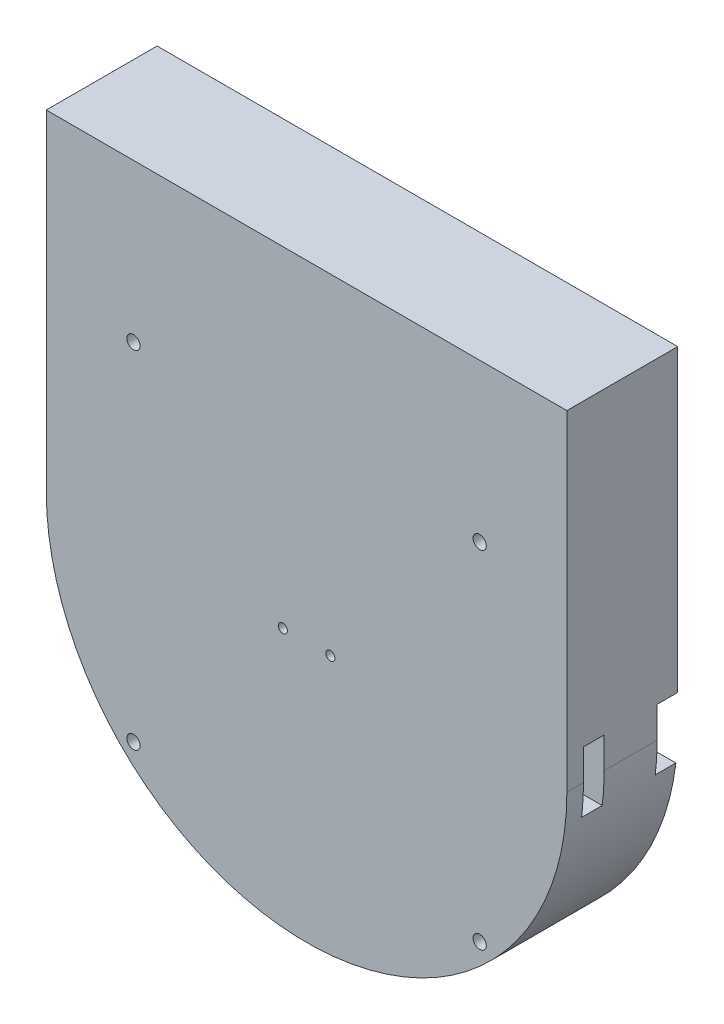
ISO-10303-21;
HEADER;
FILE_DESCRIPTION(('STEP AP214'),'2;1');
FILE_NAME('part.step','',(''),(''),'','','');
FILE_SCHEMA(('AUTOMOTIVE_DESIGN { 1 0 10303 214 1 1 1 1 }'));
ENDSEC;
DATA;
#1=APPLICATION_CONTEXT('core data for automotive mechanical design processes');
#2=APPLICATION_PROTOCOL_DEFINITION('international standard','automotive_design',2000,#1);
#3=PRODUCT_CONTEXT('',#1,'mechanical');
#4=PRODUCT('Part','Part','',(#3));
#5=PRODUCT_RELATED_PRODUCT_CATEGORY('part','',(#4));
#6=PRODUCT_DEFINITION_FORMATION('','',#4);
#7=PRODUCT_DEFINITION_CONTEXT('part definition',#1,'design');
#8=PRODUCT_DEFINITION('design','',#6,#7);
#9=PRODUCT_DEFINITION_SHAPE('','',#8);
#10=(LENGTH_UNIT() NAMED_UNIT(*) SI_UNIT(.MILLI.,.METRE.));
#11=(NAMED_UNIT(*) PLANE_ANGLE_UNIT() SI_UNIT($,.RADIAN.));
#12=(NAMED_UNIT(*) SI_UNIT($,.STERADIAN.) SOLID_ANGLE_UNIT());
#13=UNCERTAINTY_MEASURE_WITH_UNIT(LENGTH_MEASURE(1.E-05),#10,'distance_accuracy_value','');
#14=(GEOMETRIC_REPRESENTATION_CONTEXT(3) GLOBAL_UNCERTAINTY_ASSIGNED_CONTEXT((#13)) GLOBAL_UNIT_ASSIGNED_CONTEXT((#10,
#11,#12)) REPRESENTATION_CONTEXT('',''));
#15=CARTESIAN_POINT('',(0.,0.,0.));
#16=DIRECTION('',(0.,0.,1.));
#17=DIRECTION('',(1.,0.,0.));
#18=AXIS2_PLACEMENT_3D('',#15,#16,#17);
#19=CARTESIAN_POINT('',(0.,-1.18665937942703E-13,-22.8250000000006));
#20=DIRECTION('',(0.,0.,1.));
#21=DIRECTION('',(-0.707106781186544,0.70710678118655,0.));
#22=AXIS2_PLACEMENT_3D('',#19,#20,#21);
#23=PLANE('',#22);
#24=CARTESIAN_POINT('',(-41.8960767853027,41.896076785303,-22.8250000000007));
#25=DIRECTION('',(0.,0.,-1.));
#26=DIRECTION('',(0.,1.,0.));
#27=AXIS2_PLACEMENT_3D('',#24,#25,#26);
#28=CIRCLE('',#27,1.6000000000001);
#29=CARTESIAN_POINT('',(-41.8960767853027,43.4960767853031,-22.8250000000007));
#30=VERTEX_POINT('',#29);
#31=EDGE_CURVE('E293',#30,#30,#28,.F.);
#32=ORIENTED_EDGE('',*,*,#31,.T.);
#33=EDGE_LOOP('',(#32));
#34=FACE_BOUND('',#33,.T.);
#35=CARTESIAN_POINT('',(-41.8960767853031,-41.8960767853029,-22.8250000000006));
#36=DIRECTION('',(0.,0.,-1.));
#37=DIRECTION('',(0.,1.,0.));
#38=AXIS2_PLACEMENT_3D('',#35,#36,#37);
#39=CIRCLE('',#38,1.60000000000007);
#40=CARTESIAN_POINT('',(-41.8960767853031,-40.2960767853028,-22.8250000000006));
#41=VERTEX_POINT('',#40);
#42=EDGE_CURVE('E301',#41,#41,#39,.F.);
#43=ORIENTED_EDGE('',*,*,#42,.T.);
#44=EDGE_LOOP('',(#43));
#45=FACE_BOUND('',#44,.T.);
#46=CARTESIAN_POINT('',(41.8960767853028,-41.8960767853032,-22.8250000000005));
#47=DIRECTION('',(0.,0.,-1.));
#48=DIRECTION('',(0.,1.,0.));
#49=AXIS2_PLACEMENT_3D('',#46,#47,#48);
#50=CIRCLE('',#49,1.60000000000006);
#51=CARTESIAN_POINT('',(41.8960767853028,-40.2960767853032,-22.8250000000005));
#52=VERTEX_POINT('',#51);
#53=EDGE_CURVE('E292',#52,#52,#50,.F.);
#54=ORIENTED_EDGE('',*,*,#53,.T.);
#55=EDGE_LOOP('',(#54));
#56=FACE_BOUND('',#55,.T.);
#57=CARTESIAN_POINT('',(41.8960767853031,41.8960767853026,-22.8250000000007));
#58=DIRECTION('',(0.,0.,-1.));
#59=DIRECTION('',(0.,1.,0.));
#60=AXIS2_PLACEMENT_3D('',#57,#58,#59);
#61=CIRCLE('',#60,1.60000000000009);
#62=CARTESIAN_POINT('',(41.8960767853031,43.4960767853027,-22.8250000000007));
#63=VERTEX_POINT('',#62);
#64=EDGE_CURVE('E282',#63,#63,#61,.F.);
#65=ORIENTED_EDGE('',*,*,#64,.T.);
#66=EDGE_LOOP('',(#65));
#67=FACE_BOUND('',#66,.T.);
#68=CARTESIAN_POINT('',(0.,0.,-22.8250000000006));
#69=DIRECTION('',(0.,0.,-1.));
#70=DIRECTION('',(0.,1.,0.));
#71=AXIS2_PLACEMENT_3D('',#68,#69,#70);
#72=CIRCLE('',#71,55.);
#73=CARTESIAN_POINT('',(54.4862367942584,-7.5,-22.8250000000006));
#74=VERTEX_POINT('',#73);
#75=CARTESIAN_POINT('',(54.4862367942584,7.49999999999999,-22.8250000000008));
#76=VERTEX_POINT('',#75);
#77=EDGE_CURVE('E11',#74,#76,#72,.T.);
#78=ORIENTED_EDGE('',*,*,#77,.F.);
#79=DIRECTION('',(1.,0.,0.));
#80=VECTOR('',#79,1.);
#81=CARTESIAN_POINT('',(-63.001,-7.5,-22.8250000000008));
#82=LINE('',#81,#80);
#83=CARTESIAN_POINT('',(62.5519783859791,-7.5,-22.8250000000008));
#84=VERTEX_POINT('',#83);
#85=EDGE_CURVE('E195',#74,#84,#82,.T.);
#86=ORIENTED_EDGE('',*,*,#85,.T.);
#87=CARTESIAN_POINT('',(0.,0.,-22.8250000000006));
#88=DIRECTION('',(0.,0.,-1.));
#89=DIRECTION('',(0.,1.,0.));
#90=AXIS2_PLACEMENT_3D('',#87,#88,#89);
#91=CIRCLE('',#90,63.);
#92=CARTESIAN_POINT('',(-63.,0.,-22.8250000000007));
#93=VERTEX_POINT('',#92);
#94=EDGE_CURVE('E231',#84,#93,#91,.T.);
#95=ORIENTED_EDGE('',*,*,#94,.T.);
#96=DIRECTION('',(0.,1.,0.));
#97=VECTOR('',#96,1.);
#98=CARTESIAN_POINT('',(-63.,80.0000000000004,-22.8250000000008));
#99=LINE('',#98,#97);
#100=CARTESIAN_POINT('',(-63.,80.,-22.8250000000008));
#101=VERTEX_POINT('',#100);
#102=EDGE_CURVE('E226',#93,#101,#99,.T.);
#103=ORIENTED_EDGE('',*,*,#102,.T.);
#104=DIRECTION('',(1.,0.,0.));
#105=VECTOR('',#104,1.);
#106=CARTESIAN_POINT('',(-63.0000000000001,80.,-22.8250000000008));
#107=LINE('',#106,#105);
#108=CARTESIAN_POINT('',(63.,80.,-22.8250000000008));
#109=VERTEX_POINT('',#108);
#110=EDGE_CURVE('E235',#101,#109,#107,.T.);
#111=ORIENTED_EDGE('',*,*,#110,.T.);
#112=DIRECTION('',(0.,-1.,0.));
#113=VECTOR('',#112,1.);
#114=CARTESIAN_POINT('',(63.,80.0000000000004,-22.8250000000008));
#115=LINE('',#114,#113);
#116=CARTESIAN_POINT('',(63.,7.49999999999999,-22.8250000000008));
#117=VERTEX_POINT('',#116);
#118=EDGE_CURVE('E230',#109,#117,#115,.T.);
#119=ORIENTED_EDGE('',*,*,#118,.T.);
#120=DIRECTION('',(1.,0.,0.));
#121=VECTOR('',#120,1.);
#122=CARTESIAN_POINT('',(-63.001,7.49999999999999,-22.8250000000008));
#123=LINE('',#122,#121);
#124=EDGE_CURVE('E198',#76,#117,#123,.T.);
#125=ORIENTED_EDGE('',*,*,#124,.F.);
#126=EDGE_LOOP('',(#78,#86,#95,#103,#111,#119,#125));
#127=FACE_BOUND('',#126,.T.);
#128=CARTESIAN_POINT('',(-59.25,1.2490009027033E-13,-22.8250000000007));
#129=DIRECTION('',(0.,0.,-1.));
#130=DIRECTION('',(0.,1.,0.));
#131=AXIS2_PLACEMENT_3D('',#128,#129,#130);
#132=CIRCLE('',#131,1.60000000000008);
#133=CARTESIAN_POINT('',(-57.6499999999999,1.2490009027033E-13,-22.8250000000006));
#134=VERTEX_POINT('',#133);
#135=EDGE_CURVE('E317',#134,#134,#132,.T.);
#136=ORIENTED_EDGE('',*,*,#135,.F.);
#137=EDGE_LOOP('',(#136));
#138=FACE_BOUND('',#137,.T.);
#139=CARTESIAN_POINT('',(0.,59.2499999999999,-22.8250000000008));
#140=DIRECTION('',(0.,0.,-1.));
#141=DIRECTION('',(0.,1.,0.));
#142=AXIS2_PLACEMENT_3D('',#139,#140,#141);
#143=CIRCLE('',#142,1.60000000000012);
#144=CARTESIAN_POINT('',(1.60000000000008,59.2499999999999,-22.8250000000008));
#145=VERTEX_POINT('',#144);
#146=EDGE_CURVE('E311',#145,#145,#143,.T.);
#147=ORIENTED_EDGE('',*,*,#146,.F.);
#148=EDGE_LOOP('',(#147));
#149=FACE_BOUND('',#148,.T.);
#150=ADVANCED_FACE('F45',(#34,#45,#56,#67,#127,#138,#149),#23,.F.);
#151=CARTESIAN_POINT('',(-63.,80.,-213.41618552546));
#152=DIRECTION('',(1.,0.,0.));
#153=DIRECTION('',(0.,0.,1.));
#154=AXIS2_PLACEMENT_3D('',#151,#152,#153);
#155=PLANE('',#154);
#156=DIRECTION('',(0.,0.,1.));
#157=VECTOR('',#156,1.);
#158=CARTESIAN_POINT('',(-63.,0.,-213.41618552546));
#159=LINE('',#158,#157);
#160=CARTESIAN_POINT('',(-63.,0.,4.));
#161=VERTEX_POINT('',#160);
#162=EDGE_CURVE('E227',#93,#161,#159,.T.);
#163=ORIENTED_EDGE('',*,*,#162,.T.);
#164=DIRECTION('',(0.,-1.,0.));
#165=VECTOR('',#164,1.);
#166=CARTESIAN_POINT('',(-63.,0.,4.));
#167=LINE('',#166,#165);
#168=CARTESIAN_POINT('',(-63.,80.,4.));
#169=VERTEX_POINT('',#168);
#170=EDGE_CURVE('E163',#169,#161,#167,.T.);
#171=ORIENTED_EDGE('',*,*,#170,.F.);
#172=DIRECTION('',(0.,0.,1.));
#173=VECTOR('',#172,1.);
#174=CARTESIAN_POINT('',(-63.,80.,-213.41618552546));
#175=LINE('',#174,#173);
#176=EDGE_CURVE('E237',#101,#169,#175,.T.);
#177=ORIENTED_EDGE('',*,*,#176,.F.);
#178=ORIENTED_EDGE('',*,*,#102,.F.);
#179=EDGE_LOOP('',(#163,#171,#177,#178));
#180=FACE_BOUND('',#179,.T.);
#181=ADVANCED_FACE('F269',(#180),#155,.F.);
#182=CARTESIAN_POINT('',(0.,0.,-213.41618552546));
#183=DIRECTION('',(0.,0.,1.));
#184=DIRECTION('',(-1.,0.,0.));
#185=AXIS2_PLACEMENT_3D('',#182,#183,#184);
#186=CYLINDRICAL_SURFACE('',#185,63.);
#187=CARTESIAN_POINT('',(0.,0.,-17.8250000000008));
#188=DIRECTION('',(0.,0.,-1.));
#189=DIRECTION('',(0.,1.,0.));
#190=AXIS2_PLACEMENT_3D('',#187,#188,#189);
#191=CIRCLE('',#190,63.);
#192=CARTESIAN_POINT('',(62.5519783859791,-7.5,-17.8250000000008));
#193=VERTEX_POINT('',#192);
#194=CARTESIAN_POINT('',(63.,0.,-17.8250000000008));
#195=VERTEX_POINT('',#194);
#196=EDGE_CURVE('E179',#193,#195,#191,.F.);
#197=ORIENTED_EDGE('',*,*,#196,.T.);
#198=DIRECTION('',(0.,0.,1.));
#199=VECTOR('',#198,1.);
#200=CARTESIAN_POINT('',(63.,0.,-213.41618552546));
#201=LINE('',#200,#199);
#202=CARTESIAN_POINT('',(63.,0.,-5.));
#203=VERTEX_POINT('',#202);
#204=EDGE_CURVE('E232',#195,#203,#201,.T.);
#205=ORIENTED_EDGE('',*,*,#204,.T.);
#206=CARTESIAN_POINT('',(0.,0.,-5.));
#207=DIRECTION('',(0.,0.,1.));
#208=DIRECTION('',(0.,-1.,0.));
#209=AXIS2_PLACEMENT_3D('',#206,#207,#208);
#210=CIRCLE('',#209,63.);
#211=CARTESIAN_POINT('',(62.5519783859791,-7.5,-5.));
#212=VERTEX_POINT('',#211);
#213=EDGE_CURVE('E180',#203,#212,#210,.F.);
#214=ORIENTED_EDGE('',*,*,#213,.T.);
#215=DIRECTION('',(0.,0.,1.));
#216=VECTOR('',#215,1.);
#217=CARTESIAN_POINT('',(62.5519783859791,-7.5,-213.41618552546));
#218=LINE('',#217,#216);
#219=CARTESIAN_POINT('',(62.5519783859791,-7.5,0.));
#220=VERTEX_POINT('',#219);
#221=EDGE_CURVE('E169',#212,#220,#218,.T.);
#222=ORIENTED_EDGE('',*,*,#221,.T.);
#223=CARTESIAN_POINT('',(0.,0.,0.));
#224=DIRECTION('',(0.,0.,-1.));
#225=DIRECTION('',(-1.,0.,0.));
#226=AXIS2_PLACEMENT_3D('',#223,#224,#225);
#227=CIRCLE('',#226,63.);
#228=CARTESIAN_POINT('',(63.,0.,0.));
#229=VERTEX_POINT('',#228);
#230=EDGE_CURVE('E146',#229,#220,#227,.T.);
#231=ORIENTED_EDGE('',*,*,#230,.F.);
#232=DIRECTION('',(0.,0.,-1.));
#233=VECTOR('',#232,1.);
#234=CARTESIAN_POINT('',(63.,0.,198.591185525459));
#235=LINE('',#234,#233);
#236=CARTESIAN_POINT('',(63.,0.,4.));
#237=VERTEX_POINT('',#236);
#238=EDGE_CURVE('E155',#237,#229,#235,.T.);
#239=ORIENTED_EDGE('',*,*,#238,.F.);
#240=CARTESIAN_POINT('',(0.,0.,4.));
#241=DIRECTION('',(0.,0.,1.));
#242=DIRECTION('',(1.,0.,0.));
#243=AXIS2_PLACEMENT_3D('',#240,#241,#242);
#244=CIRCLE('',#243,63.);
#245=EDGE_CURVE('E175',#161,#237,#244,.T.);
#246=ORIENTED_EDGE('',*,*,#245,.F.);
#247=ORIENTED_EDGE('',*,*,#162,.F.);
#248=ORIENTED_EDGE('',*,*,#94,.F.);
#249=DIRECTION('',(0.,0.,1.));
#250=VECTOR('',#249,1.);
#251=CARTESIAN_POINT('',(62.5519783859791,-7.50000000000003,-213.41618552546));
#252=LINE('',#251,#250);
#253=EDGE_CURVE('E176',#84,#193,#252,.T.);
#254=ORIENTED_EDGE('',*,*,#253,.T.);
#255=EDGE_LOOP('',(#197,#205,#214,#222,#231,#239,#246,#247,#248,#254));
#256=FACE_BOUND('',#255,.T.);
#257=ADVANCED_FACE('F166',(#256),#186,.T.);
#258=CARTESIAN_POINT('',(63.,80.,-213.41618552546));
#259=DIRECTION('',(-1.,0.,0.));
#260=DIRECTION('',(0.,0.,-1.));
#261=AXIS2_PLACEMENT_3D('',#258,#259,#260);
#262=PLANE('',#261);
#263=ORIENTED_EDGE('',*,*,#118,.F.);
#264=DIRECTION('',(0.,0.,1.));
#265=VECTOR('',#264,1.);
#266=CARTESIAN_POINT('',(63.,80.,-213.41618552546));
#267=LINE('',#266,#265);
#268=CARTESIAN_POINT('',(63.,80.,4.));
#269=VERTEX_POINT('',#268);
#270=EDGE_CURVE('E52',#109,#269,#267,.T.);
#271=ORIENTED_EDGE('',*,*,#270,.T.);
#272=DIRECTION('',(0.,1.,0.));
#273=VECTOR('',#272,1.);
#274=CARTESIAN_POINT('',(63.,80.,4.));
#275=LINE('',#274,#273);
#276=EDGE_CURVE('E160',#237,#269,#275,.T.);
#277=ORIENTED_EDGE('',*,*,#276,.F.);
#278=ORIENTED_EDGE('',*,*,#238,.T.);
#279=DIRECTION('',(0.,-1.,0.));
#280=VECTOR('',#279,1.);
#281=CARTESIAN_POINT('',(63.,80.,0.));
#282=LINE('',#281,#280);
#283=CARTESIAN_POINT('',(63.,7.5,0.));
#284=VERTEX_POINT('',#283);
#285=EDGE_CURVE('E141',#284,#229,#282,.T.);
#286=ORIENTED_EDGE('',*,*,#285,.F.);
#287=DIRECTION('',(0.,0.,-1.));
#288=VECTOR('',#287,1.);
#289=CARTESIAN_POINT('',(63.,7.5,0.));
#290=LINE('',#289,#288);
#291=CARTESIAN_POINT('',(63.,7.5,-5.));
#292=VERTEX_POINT('',#291);
#293=EDGE_CURVE('E215',#284,#292,#290,.T.);
#294=ORIENTED_EDGE('',*,*,#293,.T.);
#295=DIRECTION('',(0.,-1.,0.));
#296=VECTOR('',#295,1.);
#297=CARTESIAN_POINT('',(63.,7.5,-5.));
#298=LINE('',#297,#296);
#299=EDGE_CURVE('E208',#292,#203,#298,.T.);
#300=ORIENTED_EDGE('',*,*,#299,.T.);
#301=ORIENTED_EDGE('',*,*,#204,.F.);
#302=DIRECTION('',(0.,1.,0.));
#303=VECTOR('',#302,1.);
#304=CARTESIAN_POINT('',(63.,-7.5,-17.8250000000008));
#305=LINE('',#304,#303);
#306=CARTESIAN_POINT('',(63.,7.5,-17.8250000000008));
#307=VERTEX_POINT('',#306);
#308=EDGE_CURVE('E186',#195,#307,#305,.T.);
#309=ORIENTED_EDGE('',*,*,#308,.T.);
#310=DIRECTION('',(0.,0.,-1.));
#311=VECTOR('',#310,1.);
#312=CARTESIAN_POINT('',(63.,7.5,-17.8250000000008));
#313=LINE('',#312,#311);
#314=EDGE_CURVE('E189',#307,#117,#313,.T.);
#315=ORIENTED_EDGE('',*,*,#314,.T.);
#316=EDGE_LOOP('',(#263,#271,#277,#278,#286,#294,#300,#301,#309,#315));
#317=FACE_BOUND('',#316,.T.);
#318=ADVANCED_FACE('F157',(#317),#262,.F.);
#319=CARTESIAN_POINT('',(-63.,80.,-213.41618552546));
#320=DIRECTION('',(0.,-1.,0.));
#321=DIRECTION('',(0.,0.,1.));
#322=AXIS2_PLACEMENT_3D('',#319,#320,#321);
#323=PLANE('',#322);
#324=ORIENTED_EDGE('',*,*,#176,.T.);
#325=DIRECTION('',(-1.,0.,0.));
#326=VECTOR('',#325,1.);
#327=CARTESIAN_POINT('',(-63.,80.,4.));
#328=LINE('',#327,#326);
#329=EDGE_CURVE('E206',#269,#169,#328,.T.);
#330=ORIENTED_EDGE('',*,*,#329,.F.);
#331=ORIENTED_EDGE('',*,*,#270,.F.);
#332=ORIENTED_EDGE('',*,*,#110,.F.);
#333=EDGE_LOOP('',(#324,#330,#331,#332));
#334=FACE_BOUND('',#333,.T.);
#335=ADVANCED_FACE('F253',(#334),#323,.F.);
#336=CARTESIAN_POINT('',(0.,0.,-213.41618552546));
#337=DIRECTION('',(0.,0.,1.));
#338=DIRECTION('',(-1.,0.,0.));
#339=AXIS2_PLACEMENT_3D('',#336,#337,#338);
#340=CYLINDRICAL_SURFACE('',#339,55.);
#341=DIRECTION('',(0.,0.,1.));
#342=VECTOR('',#341,1.);
#343=CARTESIAN_POINT('',(54.4862367942585,7.49999999999963,-213.41618552546));
#344=LINE('',#343,#342);
#345=CARTESIAN_POINT('',(54.4862367942585,7.49999999999963,-17.8250000000008));
#346=VERTEX_POINT('',#345);
#347=EDGE_CURVE('E194',#346,#76,#344,.F.);
#348=ORIENTED_EDGE('',*,*,#347,.F.);
#349=CARTESIAN_POINT('',(0.,0.,-17.8250000000008));
#350=DIRECTION('',(0.,0.,-1.));
#351=DIRECTION('',(0.,1.,0.));
#352=AXIS2_PLACEMENT_3D('',#349,#350,#351);
#353=CIRCLE('',#352,55.);
#354=CARTESIAN_POINT('',(54.4862367942584,-7.5,-17.8250000000008));
#355=VERTEX_POINT('',#354);
#356=EDGE_CURVE('E182',#355,#346,#353,.F.);
#357=ORIENTED_EDGE('',*,*,#356,.F.);
#358=DIRECTION('',(0.,0.,1.));
#359=VECTOR('',#358,1.);
#360=CARTESIAN_POINT('',(54.4862367942584,-7.50000000000003,-213.41618552546));
#361=LINE('',#360,#359);
#362=EDGE_CURVE('E66',#74,#355,#361,.T.);
#363=ORIENTED_EDGE('',*,*,#362,.F.);
#364=ORIENTED_EDGE('',*,*,#77,.T.);
#365=EDGE_LOOP('',(#348,#357,#363,#364));
#366=FACE_BOUND('',#365,.T.);
#367=DIRECTION('',(0.,0.,1.));
#368=VECTOR('',#367,1.);
#369=CARTESIAN_POINT('',(54.4862367942584,-7.5,-213.41618552546));
#370=LINE('',#369,#368);
#371=CARTESIAN_POINT('',(54.4862367942584,-7.5,-5.));
#372=VERTEX_POINT('',#371);
#373=CARTESIAN_POINT('',(54.4862367942584,-7.5,0.));
#374=VERTEX_POINT('',#373);
#375=EDGE_CURVE('E219',#372,#374,#370,.T.);
#376=ORIENTED_EDGE('',*,*,#375,.F.);
#377=CARTESIAN_POINT('',(0.,0.,-5.));
#378=DIRECTION('',(0.,0.,1.));
#379=DIRECTION('',(0.,-1.,0.));
#380=AXIS2_PLACEMENT_3D('',#377,#378,#379);
#381=CIRCLE('',#380,55.);
#382=CARTESIAN_POINT('',(54.4862367942584,7.49999999999993,-5.));
#383=VERTEX_POINT('',#382);
#384=EDGE_CURVE('E204',#383,#372,#381,.F.);
#385=ORIENTED_EDGE('',*,*,#384,.F.);
#386=DIRECTION('',(0.,0.,1.));
#387=VECTOR('',#386,1.);
#388=CARTESIAN_POINT('',(54.4862367942584,7.49999999999993,-213.41618552546));
#389=LINE('',#388,#387);
#390=CARTESIAN_POINT('',(54.4862367942584,7.5,0.));
#391=VERTEX_POINT('',#390);
#392=EDGE_CURVE('E217',#391,#383,#389,.F.);
#393=ORIENTED_EDGE('',*,*,#392,.F.);
#394=CARTESIAN_POINT('',(0.,0.,0.));
#395=DIRECTION('',(0.,0.,1.));
#396=DIRECTION('',(1.,0.,0.));
#397=AXIS2_PLACEMENT_3D('',#394,#395,#396);
#398=CIRCLE('',#397,55.);
#399=EDGE_CURVE('E203',#391,#374,#398,.T.);
#400=ORIENTED_EDGE('',*,*,#399,.T.);
#401=EDGE_LOOP('',(#376,#385,#393,#400));
#402=FACE_BOUND('',#401,.T.);
#403=ADVANCED_FACE('F260',(#366,#402),#340,.F.);
#404=CARTESIAN_POINT('',(-63.001,7.5,-17.8250000000008));
#405=DIRECTION('',(0.,1.,0.));
#406=DIRECTION('',(0.,0.,-1.));
#407=AXIS2_PLACEMENT_3D('',#404,#405,#406);
#408=PLANE('',#407);
#409=DIRECTION('',(1.,0.,0.));
#410=VECTOR('',#409,1.);
#411=CARTESIAN_POINT('',(-63.001,7.5,-17.8250000000008));
#412=LINE('',#411,#410);
#413=EDGE_CURVE('E191',#346,#307,#412,.T.);
#414=ORIENTED_EDGE('',*,*,#413,.F.);
#415=ORIENTED_EDGE('',*,*,#347,.T.);
#416=ORIENTED_EDGE('',*,*,#124,.T.);
#417=ORIENTED_EDGE('',*,*,#314,.F.);
#418=EDGE_LOOP('',(#414,#415,#416,#417));
#419=FACE_BOUND('',#418,.T.);
#420=ADVANCED_FACE('F258',(#419),#408,.F.);
#421=CARTESIAN_POINT('',(-63.001,-7.5,-17.8250000000008));
#422=DIRECTION('',(0.,-1.,0.));
#423=DIRECTION('',(0.,0.,1.));
#424=AXIS2_PLACEMENT_3D('',#421,#422,#423);
#425=PLANE('',#424);
#426=ORIENTED_EDGE('',*,*,#253,.F.);
#427=ORIENTED_EDGE('',*,*,#85,.F.);
#428=ORIENTED_EDGE('',*,*,#362,.T.);
#429=DIRECTION('',(1.,0.,0.));
#430=VECTOR('',#429,1.);
#431=CARTESIAN_POINT('',(-63.001,-7.5,-17.8250000000008));
#432=LINE('',#431,#430);
#433=EDGE_CURVE('E192',#355,#193,#432,.T.);
#434=ORIENTED_EDGE('',*,*,#433,.T.);
#435=EDGE_LOOP('',(#426,#427,#428,#434));
#436=FACE_BOUND('',#435,.T.);
#437=ADVANCED_FACE('F266',(#436),#425,.F.);
#438=CARTESIAN_POINT('',(-63.001,-7.5,-17.8250000000008));
#439=DIRECTION('',(0.,0.,1.));
#440=DIRECTION('',(0.,1.,0.));
#441=AXIS2_PLACEMENT_3D('',#438,#439,#440);
#442=PLANE('',#441);
#443=ORIENTED_EDGE('',*,*,#196,.F.);
#444=ORIENTED_EDGE('',*,*,#433,.F.);
#445=ORIENTED_EDGE('',*,*,#356,.T.);
#446=ORIENTED_EDGE('',*,*,#413,.T.);
#447=ORIENTED_EDGE('',*,*,#308,.F.);
#448=EDGE_LOOP('',(#443,#444,#445,#446,#447));
#449=FACE_BOUND('',#448,.T.);
#450=ADVANCED_FACE('F264',(#449),#442,.F.);
#451=CARTESIAN_POINT('',(-63.001,7.5,-5.));
#452=DIRECTION('',(0.,0.,-1.));
#453=DIRECTION('',(0.,-1.,0.));
#454=AXIS2_PLACEMENT_3D('',#451,#452,#453);
#455=PLANE('',#454);
#456=ORIENTED_EDGE('',*,*,#213,.F.);
#457=ORIENTED_EDGE('',*,*,#299,.F.);
#458=DIRECTION('',(1.,0.,0.));
#459=VECTOR('',#458,1.);
#460=CARTESIAN_POINT('',(-63.001,7.5,-5.));
#461=LINE('',#460,#459);
#462=EDGE_CURVE('E59',#383,#292,#461,.T.);
#463=ORIENTED_EDGE('',*,*,#462,.F.);
#464=ORIENTED_EDGE('',*,*,#384,.T.);
#465=DIRECTION('',(1.,0.,0.));
#466=VECTOR('',#465,1.);
#467=CARTESIAN_POINT('',(-63.001,-7.5,-5.));
#468=LINE('',#467,#466);
#469=EDGE_CURVE('E209',#372,#212,#468,.T.);
#470=ORIENTED_EDGE('',*,*,#469,.T.);
#471=EDGE_LOOP('',(#456,#457,#463,#464,#470));
#472=FACE_BOUND('',#471,.T.);
#473=ADVANCED_FACE('F386',(#472),#455,.F.);
#474=CARTESIAN_POINT('',(-63.001,-7.5,-5.));
#475=DIRECTION('',(0.,-1.,0.));
#476=DIRECTION('',(0.,0.,1.));
#477=AXIS2_PLACEMENT_3D('',#474,#475,#476);
#478=PLANE('',#477);
#479=ORIENTED_EDGE('',*,*,#221,.F.);
#480=ORIENTED_EDGE('',*,*,#469,.F.);
#481=ORIENTED_EDGE('',*,*,#375,.T.);
#482=DIRECTION('',(1.,0.,0.));
#483=VECTOR('',#482,1.);
#484=CARTESIAN_POINT('',(-63.001,-7.5,0.));
#485=LINE('',#484,#483);
#486=EDGE_CURVE('E211',#374,#220,#485,.T.);
#487=ORIENTED_EDGE('',*,*,#486,.T.);
#488=EDGE_LOOP('',(#479,#480,#481,#487));
#489=FACE_BOUND('',#488,.T.);
#490=ADVANCED_FACE('F389',(#489),#478,.F.);
#491=CARTESIAN_POINT('',(-63.001,7.5,0.));
#492=DIRECTION('',(0.,1.,0.));
#493=DIRECTION('',(0.,0.,-1.));
#494=AXIS2_PLACEMENT_3D('',#491,#492,#493);
#495=PLANE('',#494);
#496=DIRECTION('',(1.,0.,0.));
#497=VECTOR('',#496,1.);
#498=CARTESIAN_POINT('',(-63.001,7.5,0.));
#499=LINE('',#498,#497);
#500=EDGE_CURVE('E148',#391,#284,#499,.T.);
#501=ORIENTED_EDGE('',*,*,#500,.F.);
#502=ORIENTED_EDGE('',*,*,#392,.T.);
#503=ORIENTED_EDGE('',*,*,#462,.T.);
#504=ORIENTED_EDGE('',*,*,#293,.F.);
#505=EDGE_LOOP('',(#501,#502,#503,#504));
#506=FACE_BOUND('',#505,.T.);
#507=ADVANCED_FACE('F378',(#506),#495,.F.);
#508=CARTESIAN_POINT('',(0.,0.,0.));
#509=DIRECTION('',(0.,0.,1.));
#510=DIRECTION('',(-1.,0.,0.));
#511=AXIS2_PLACEMENT_3D('',#508,#509,#510);
#512=PLANE('',#511);
#513=CARTESIAN_POINT('',(5.75,0.,0.));
#514=DIRECTION('',(0.,0.,-1.));
#515=DIRECTION('',(-1.,0.,0.));
#516=AXIS2_PLACEMENT_3D('',#513,#514,#515);
#517=CIRCLE('',#516,1.10000000000001);
#518=CARTESIAN_POINT('',(4.64999999999999,0.,0.));
#519=VERTEX_POINT('',#518);
#520=EDGE_CURVE('E152',#519,#519,#517,.F.);
#521=ORIENTED_EDGE('',*,*,#520,.T.);
#522=EDGE_LOOP('',(#521));
#523=FACE_BOUND('',#522,.T.);
#524=CARTESIAN_POINT('',(-5.75,0.,0.));
#525=DIRECTION('',(0.,0.,-1.));
#526=DIRECTION('',(-1.,0.,0.));
#527=AXIS2_PLACEMENT_3D('',#524,#525,#526);
#528=CIRCLE('',#527,1.1);
#529=CARTESIAN_POINT('',(-6.85,0.,0.));
#530=VERTEX_POINT('',#529);
#531=EDGE_CURVE('E279',#530,#530,#528,.F.);
#532=ORIENTED_EDGE('',*,*,#531,.T.);
#533=EDGE_LOOP('',(#532));
#534=FACE_BOUND('',#533,.T.);
#535=ORIENTED_EDGE('',*,*,#399,.F.);
#536=ORIENTED_EDGE('',*,*,#500,.T.);
#537=ORIENTED_EDGE('',*,*,#285,.T.);
#538=ORIENTED_EDGE('',*,*,#230,.T.);
#539=ORIENTED_EDGE('',*,*,#486,.F.);
#540=EDGE_LOOP('',(#535,#536,#537,#538,#539));
#541=FACE_BOUND('',#540,.T.);
#542=ADVANCED_FACE('F144',(#523,#534,#541),#512,.F.);
#543=CARTESIAN_POINT('',(0.,-0.01892492878625,4.));
#544=DIRECTION('',(0.,0.,-1.));
#545=DIRECTION('',(1.,0.,0.));
#546=AXIS2_PLACEMENT_3D('',#543,#544,#545);
#547=PLANE('',#546);
#548=CARTESIAN_POINT('',(-41.8960767853027,41.896076785303,4.));
#549=DIRECTION('',(0.,0.,-1.));
#550=DIRECTION('',(-1.,0.,0.));
#551=AXIS2_PLACEMENT_3D('',#548,#549,#550);
#552=CIRCLE('',#551,1.6000000000001);
#553=CARTESIAN_POINT('',(-43.4960767853028,41.896076785303,4.));
#554=VERTEX_POINT('',#553);
#555=EDGE_CURVE('E297',#554,#554,#552,.T.);
#556=ORIENTED_EDGE('',*,*,#555,.T.);
#557=EDGE_LOOP('',(#556));
#558=FACE_BOUND('',#557,.T.);
#559=CARTESIAN_POINT('',(-41.8960767853031,-41.8960767853029,4.));
#560=DIRECTION('',(0.,0.,-1.));
#561=DIRECTION('',(-1.,0.,0.));
#562=AXIS2_PLACEMENT_3D('',#559,#560,#561);
#563=CIRCLE('',#562,1.60000000000007);
#564=CARTESIAN_POINT('',(-43.4960767853032,-41.8960767853029,4.));
#565=VERTEX_POINT('',#564);
#566=EDGE_CURVE('E296',#565,#565,#563,.T.);
#567=ORIENTED_EDGE('',*,*,#566,.T.);
#568=EDGE_LOOP('',(#567));
#569=FACE_BOUND('',#568,.T.);
#570=CARTESIAN_POINT('',(41.8960767853028,-41.8960767853032,4.));
#571=DIRECTION('',(0.,0.,-1.));
#572=DIRECTION('',(-1.,0.,0.));
#573=AXIS2_PLACEMENT_3D('',#570,#571,#572);
#574=CIRCLE('',#573,1.60000000000006);
#575=CARTESIAN_POINT('',(40.2960767853027,-41.8960767853032,4.));
#576=VERTEX_POINT('',#575);
#577=EDGE_CURVE('E304',#576,#576,#574,.T.);
#578=ORIENTED_EDGE('',*,*,#577,.T.);
#579=EDGE_LOOP('',(#578));
#580=FACE_BOUND('',#579,.T.);
#581=CARTESIAN_POINT('',(41.8960767853031,41.8960767853026,4.));
#582=DIRECTION('',(0.,0.,-1.));
#583=DIRECTION('',(-1.,0.,0.));
#584=AXIS2_PLACEMENT_3D('',#581,#582,#583);
#585=CIRCLE('',#584,1.60000000000009);
#586=CARTESIAN_POINT('',(40.2960767853031,41.8960767853026,4.));
#587=VERTEX_POINT('',#586);
#588=EDGE_CURVE('E289',#587,#587,#585,.T.);
#589=ORIENTED_EDGE('',*,*,#588,.T.);
#590=EDGE_LOOP('',(#589));
#591=FACE_BOUND('',#590,.T.);
#592=CARTESIAN_POINT('',(5.75,0.,4.));
#593=DIRECTION('',(0.,0.,-1.));
#594=DIRECTION('',(-1.,0.,0.));
#595=AXIS2_PLACEMENT_3D('',#592,#593,#594);
#596=CIRCLE('',#595,1.10000000000001);
#597=CARTESIAN_POINT('',(4.64999999999999,0.,4.));
#598=VERTEX_POINT('',#597);
#599=EDGE_CURVE('E278',#598,#598,#596,.T.);
#600=ORIENTED_EDGE('',*,*,#599,.T.);
#601=EDGE_LOOP('',(#600));
#602=FACE_BOUND('',#601,.T.);
#603=CARTESIAN_POINT('',(-5.75,0.,4.));
#604=DIRECTION('',(0.,0.,-1.));
#605=DIRECTION('',(-1.,0.,0.));
#606=AXIS2_PLACEMENT_3D('',#603,#604,#605);
#607=CIRCLE('',#606,1.1);
#608=CARTESIAN_POINT('',(-6.85,0.,4.));
#609=VERTEX_POINT('',#608);
#610=EDGE_CURVE('E275',#609,#609,#607,.T.);
#611=ORIENTED_EDGE('',*,*,#610,.T.);
#612=EDGE_LOOP('',(#611));
#613=FACE_BOUND('',#612,.T.);
#614=ORIENTED_EDGE('',*,*,#276,.T.);
#615=ORIENTED_EDGE('',*,*,#329,.T.);
#616=ORIENTED_EDGE('',*,*,#170,.T.);
#617=ORIENTED_EDGE('',*,*,#245,.T.);
#618=EDGE_LOOP('',(#614,#615,#616,#617));
#619=FACE_BOUND('',#618,.T.);
#620=ADVANCED_FACE('F271',(#558,#569,#580,#591,#602,#613,#619),#547,.F.);
#621=CARTESIAN_POINT('',(-5.75,0.,-22.8260000000008));
#622=DIRECTION('',(0.,0.,1.));
#623=DIRECTION('',(-1.,0.,0.));
#624=AXIS2_PLACEMENT_3D('',#621,#622,#623);
#625=CYLINDRICAL_SURFACE('',#624,1.1);
#626=ORIENTED_EDGE('',*,*,#610,.F.);
#627=EDGE_LOOP('',(#626));
#628=FACE_BOUND('',#627,.T.);
#629=ORIENTED_EDGE('',*,*,#531,.F.);
#630=EDGE_LOOP('',(#629));
#631=FACE_BOUND('',#630,.T.);
#632=ADVANCED_FACE('F368',(#628,#631),#625,.F.);
#633=CARTESIAN_POINT('',(5.75,0.,-22.8260000000008));
#634=DIRECTION('',(0.,0.,1.));
#635=DIRECTION('',(-1.,0.,0.));
#636=AXIS2_PLACEMENT_3D('',#633,#634,#635);
#637=CYLINDRICAL_SURFACE('',#636,1.10000000000001);
#638=ORIENTED_EDGE('',*,*,#599,.F.);
#639=EDGE_LOOP('',(#638));
#640=FACE_BOUND('',#639,.T.);
#641=ORIENTED_EDGE('',*,*,#520,.F.);
#642=EDGE_LOOP('',(#641));
#643=FACE_BOUND('',#642,.T.);
#644=ADVANCED_FACE('F364',(#640,#643),#637,.F.);
#645=CARTESIAN_POINT('',(41.8960767853031,41.8960767853026,-22.8260000000008));
#646=DIRECTION('',(0.,0.,1.));
#647=DIRECTION('',(-1.,0.,0.));
#648=AXIS2_PLACEMENT_3D('',#645,#646,#647);
#649=CYLINDRICAL_SURFACE('',#648,1.60000000000009);
#650=ORIENTED_EDGE('',*,*,#588,.F.);
#651=EDGE_LOOP('',(#650));
#652=FACE_BOUND('',#651,.T.);
#653=ORIENTED_EDGE('',*,*,#64,.F.);
#654=EDGE_LOOP('',(#653));
#655=FACE_BOUND('',#654,.T.);
#656=ADVANCED_FACE('F354',(#652,#655),#649,.F.);
#657=CARTESIAN_POINT('',(41.8960767853028,-41.8960767853032,-22.8260000000008));
#658=DIRECTION('',(0.,0.,1.));
#659=DIRECTION('',(-1.,0.,0.));
#660=AXIS2_PLACEMENT_3D('',#657,#658,#659);
#661=CYLINDRICAL_SURFACE('',#660,1.60000000000006);
#662=ORIENTED_EDGE('',*,*,#577,.F.);
#663=EDGE_LOOP('',(#662));
#664=FACE_BOUND('',#663,.T.);
#665=ORIENTED_EDGE('',*,*,#53,.F.);
#666=EDGE_LOOP('',(#665));
#667=FACE_BOUND('',#666,.T.);
#668=ADVANCED_FACE('F350',(#664,#667),#661,.F.);
#669=CARTESIAN_POINT('',(-41.8960767853031,-41.8960767853029,-22.8260000000008));
#670=DIRECTION('',(0.,0.,1.));
#671=DIRECTION('',(-1.,0.,0.));
#672=AXIS2_PLACEMENT_3D('',#669,#670,#671);
#673=CYLINDRICAL_SURFACE('',#672,1.60000000000007);
#674=ORIENTED_EDGE('',*,*,#566,.F.);
#675=EDGE_LOOP('',(#674));
#676=FACE_BOUND('',#675,.T.);
#677=ORIENTED_EDGE('',*,*,#42,.F.);
#678=EDGE_LOOP('',(#677));
#679=FACE_BOUND('',#678,.T.);
#680=ADVANCED_FACE('F353',(#676,#679),#673,.F.);
#681=CARTESIAN_POINT('',(-41.8960767853027,41.896076785303,-22.8260000000008));
#682=DIRECTION('',(0.,0.,1.));
#683=DIRECTION('',(-1.,0.,0.));
#684=AXIS2_PLACEMENT_3D('',#681,#682,#683);
#685=CYLINDRICAL_SURFACE('',#684,1.6000000000001);
#686=ORIENTED_EDGE('',*,*,#555,.F.);
#687=EDGE_LOOP('',(#686));
#688=FACE_BOUND('',#687,.T.);
#689=ORIENTED_EDGE('',*,*,#31,.F.);
#690=EDGE_LOOP('',(#689));
#691=FACE_BOUND('',#690,.T.);
#692=ADVANCED_FACE('F328',(#688,#691),#685,.F.);
#693=CARTESIAN_POINT('',(-59.25,1.2490009027033E-13,-19.8250000000007));
#694=DIRECTION('',(0.,0.,-1.));
#695=DIRECTION('',(1.,0.,0.));
#696=AXIS2_PLACEMENT_3D('',#693,#694,#695);
#697=CYLINDRICAL_SURFACE('',#696,1.60000000000008);
#698=CARTESIAN_POINT('',(-59.25,1.2490009027033E-13,-19.8250000000007));
#699=DIRECTION('',(0.,0.,-1.));
#700=DIRECTION('',(0.,1.,0.));
#701=AXIS2_PLACEMENT_3D('',#698,#699,#700);
#702=CIRCLE('',#701,1.60000000000008);
#703=CARTESIAN_POINT('',(-57.6499999999999,1.2490009027033E-13,-19.8250000000007));
#704=VERTEX_POINT('',#703);
#705=EDGE_CURVE('E300',#704,#704,#702,.T.);
#706=CARTESIAN_POINT('',(-57.6499999999999,1.2490009027033E-13,-19.8250000000007));
#707=CARTESIAN_POINT('',(-57.6499999999999,1.2490009027033E-13,-19.8562500000007));
#708=CARTESIAN_POINT('',(-57.6499999999999,1.2490009027033E-13,-19.8875000000006));
#709=CARTESIAN_POINT('',(-57.6499999999999,1.2490009027033E-13,-19.9500000000007));
#710=CARTESIAN_POINT('',(-57.6499999999999,1.2490009027033E-13,-19.9812500000007));
#711=CARTESIAN_POINT('',(-57.6499999999999,1.2490009027033E-13,-20.0437500000007));
#712=CARTESIAN_POINT('',(-57.6499999999999,1.2490009027033E-13,-20.0750000000007));
#713=CARTESIAN_POINT('',(-57.6499999999999,1.2490009027033E-13,-20.1375000000007));
#714=CARTESIAN_POINT('',(-57.6499999999999,1.2490009027033E-13,-20.1687500000007));
#715=CARTESIAN_POINT('',(-57.6499999999999,1.2490009027033E-13,-20.2312500000007));
#716=CARTESIAN_POINT('',(-57.6499999999999,1.2490009027033E-13,-20.2625000000007));
#717=CARTESIAN_POINT('',(-57.6499999999999,1.2490009027033E-13,-20.3250000000007));
#718=CARTESIAN_POINT('',(-57.6499999999999,1.2490009027033E-13,-20.3562500000007));
#719=CARTESIAN_POINT('',(-57.6499999999999,1.2490009027033E-13,-20.4187500000007));
#720=CARTESIAN_POINT('',(-57.6499999999999,1.2490009027033E-13,-20.4500000000007));
#721=CARTESIAN_POINT('',(-57.6499999999999,1.2490009027033E-13,-20.5125000000007));
#722=CARTESIAN_POINT('',(-57.6499999999999,1.2490009027033E-13,-20.5437500000007));
#723=CARTESIAN_POINT('',(-57.6499999999999,1.2490009027033E-13,-20.6062500000007));
#724=CARTESIAN_POINT('',(-57.6499999999999,1.2490009027033E-13,-20.6375000000007));
#725=CARTESIAN_POINT('',(-57.6499999999999,1.2490009027033E-13,-20.7000000000007));
#726=CARTESIAN_POINT('',(-57.6499999999999,1.2490009027033E-13,-20.7312500000007));
#727=CARTESIAN_POINT('',(-57.6499999999999,1.2490009027033E-13,-20.7937500000007));
#728=CARTESIAN_POINT('',(-57.6499999999999,1.2490009027033E-13,-20.8250000000007));
#729=CARTESIAN_POINT('',(-57.6499999999999,1.2490009027033E-13,-20.8875000000007));
#730=CARTESIAN_POINT('',(-57.6499999999999,1.2490009027033E-13,-20.9187500000007));
#731=CARTESIAN_POINT('',(-57.6499999999999,1.2490009027033E-13,-20.9812500000007));
#732=CARTESIAN_POINT('',(-57.6499999999999,1.2490009027033E-13,-21.0125000000007));
#733=CARTESIAN_POINT('',(-57.6499999999999,1.2490009027033E-13,-21.0750000000007));
#734=CARTESIAN_POINT('',(-57.6499999999999,1.2490009027033E-13,-21.1062500000007));
#735=CARTESIAN_POINT('',(-57.6499999999999,1.2490009027033E-13,-21.1687500000007));
#736=CARTESIAN_POINT('',(-57.6499999999999,1.2490009027033E-13,-21.2000000000007));
#737=CARTESIAN_POINT('',(-57.6499999999999,1.2490009027033E-13,-21.2625000000007));
#738=CARTESIAN_POINT('',(-57.6499999999999,1.2490009027033E-13,-21.2937500000007));
#739=CARTESIAN_POINT('',(-57.6499999999999,1.2490009027033E-13,-21.3562500000007));
#740=CARTESIAN_POINT('',(-57.6499999999999,1.2490009027033E-13,-21.3875000000007));
#741=CARTESIAN_POINT('',(-57.6499999999999,1.2490009027033E-13,-21.4500000000007));
#742=CARTESIAN_POINT('',(-57.6499999999999,1.2490009027033E-13,-21.4812500000007));
#743=CARTESIAN_POINT('',(-57.6499999999999,1.2490009027033E-13,-21.5437500000007));
#744=CARTESIAN_POINT('',(-57.6499999999999,1.2490009027033E-13,-21.5750000000007));
#745=CARTESIAN_POINT('',(-57.6499999999999,1.2490009027033E-13,-21.6375000000007));
#746=CARTESIAN_POINT('',(-57.6499999999999,1.2490009027033E-13,-21.6687500000007));
#747=CARTESIAN_POINT('',(-57.6499999999999,1.2490009027033E-13,-21.7312500000007));
#748=CARTESIAN_POINT('',(-57.6499999999999,1.2490009027033E-13,-21.7625000000007));
#749=CARTESIAN_POINT('',(-57.6499999999999,1.2490009027033E-13,-21.8250000000007));
#750=CARTESIAN_POINT('',(-57.6499999999999,1.2490009027033E-13,-21.8562500000007));
#751=CARTESIAN_POINT('',(-57.6499999999999,1.2490009027033E-13,-21.9187500000007));
#752=CARTESIAN_POINT('',(-57.6499999999999,1.2490009027033E-13,-21.9500000000007));
#753=CARTESIAN_POINT('',(-57.6499999999999,1.2490009027033E-13,-22.0125000000007));
#754=CARTESIAN_POINT('',(-57.6499999999999,1.2490009027033E-13,-22.0437500000007));
#755=CARTESIAN_POINT('',(-57.6499999999999,1.2490009027033E-13,-22.1062500000007));
#756=CARTESIAN_POINT('',(-57.6499999999999,1.2490009027033E-13,-22.1375000000007));
#757=CARTESIAN_POINT('',(-57.6499999999999,1.2490009027033E-13,-22.2000000000007));
#758=CARTESIAN_POINT('',(-57.6499999999999,1.2490009027033E-13,-22.2312500000007));
#759=CARTESIAN_POINT('',(-57.6499999999999,1.2490009027033E-13,-22.2937500000007));
#760=CARTESIAN_POINT('',(-57.6499999999999,1.2490009027033E-13,-22.3250000000007));
#761=CARTESIAN_POINT('',(-57.6499999999999,1.2490009027033E-13,-22.3875000000007));
#762=CARTESIAN_POINT('',(-57.6499999999999,1.2490009027033E-13,-22.4187500000007));
#763=CARTESIAN_POINT('',(-57.6499999999999,1.2490009027033E-13,-22.4812500000007));
#764=CARTESIAN_POINT('',(-57.6499999999999,1.2490009027033E-13,-22.5125000000007));
#765=CARTESIAN_POINT('',(-57.6499999999999,1.2490009027033E-13,-22.5750000000007));
#766=CARTESIAN_POINT('',(-57.6499999999999,1.2490009027033E-13,-22.6062500000006));
#767=CARTESIAN_POINT('',(-57.6499999999999,1.2490009027033E-13,-22.6687500000006));
#768=CARTESIAN_POINT('',(-57.6499999999999,1.2490009027033E-13,-22.7000000000007));
#769=CARTESIAN_POINT('',(-57.6499999999999,1.2490009027033E-13,-22.7625000000007));
#770=CARTESIAN_POINT('',(-57.6499999999999,1.2490009027033E-13,-22.7937500000006));
#771=CARTESIAN_POINT('',(-57.6499999999999,1.2490009027033E-13,-22.8250000000006));
#772=B_SPLINE_CURVE_WITH_KNOTS('',3,(#706,#707,#708,#709,#710,#711,#712,#713,#714,#715,#716,
#717,#718,#719,#720,#721,#722,#723,#724,#725,#726,#727,#728,#729,#730,#731,#732,#733,#734,#735,
#736,#737,#738,#739,#740,#741,#742,#743,#744,#745,#746,#747,#748,#749,#750,#751,#752,#753,#754,
#755,#756,#757,#758,#759,#760,#761,#762,#763,#764,#765,#766,#767,#768,#769,#770,#771),
.UNSPECIFIED.,.F.,.F.,(4,2,2,2,2,2,2,2,2,2,2,2,2,2,2,2,2,2,2,2,2,2,2,2,2,2,2,2,2,2,2,2,4),(0.,
0.0937499999999966,0.187499999999997,0.281249999999997,0.374999999999997,0.468749999999997,
0.562499999999997,0.656249999999997,0.749999999999997,0.843749999999997,0.937499999999997,
1.03125,1.125,1.21875,1.3125,1.40625,1.5,1.59375,1.6875,1.78125,1.875,1.96875,2.0625,2.15625,
2.25,2.34375,2.4375,2.53125,2.625,2.71875,2.8125,2.90625,3.),.UNSPECIFIED.);
#773=EDGE_CURVE('BSEAM325',#704,#134,#772,.T.);
#774=ORIENTED_EDGE('',*,*,#705,.F.);
#775=ORIENTED_EDGE('',*,*,#135,.T.);
#776=ORIENTED_EDGE('',*,*,#773,.T.);
#777=ORIENTED_EDGE('',*,*,#773,.F.);
#778=EDGE_LOOP('',(#774,#776,#775,#777));
#779=FACE_BOUND('',#778,.T.);
#780=ADVANCED_FACE('F325',(#779),#697,.F.);
#781=CARTESIAN_POINT('',(-59.25,1.2490009027033E-13,-19.8250000000007));
#782=DIRECTION('',(0.,0.,1.));
#783=DIRECTION('',(0.,1.,0.));
#784=AXIS2_PLACEMENT_3D('',#781,#782,#783);
#785=PLANE('',#784);
#786=ORIENTED_EDGE('',*,*,#705,.T.);
#787=EDGE_LOOP('',(#786));
#788=FACE_BOUND('',#787,.T.);
#789=ADVANCED_FACE('F323',(#788),#785,.F.);
#790=CARTESIAN_POINT('',(0.,59.2499999999999,-19.8250000000008));
#791=DIRECTION('',(0.,0.,-1.));
#792=DIRECTION('',(1.,0.,0.));
#793=AXIS2_PLACEMENT_3D('',#790,#791,#792);
#794=CYLINDRICAL_SURFACE('',#793,1.60000000000012);
#795=CARTESIAN_POINT('',(0.,59.2499999999999,-19.8250000000008));
#796=DIRECTION('',(0.,0.,-1.));
#797=DIRECTION('',(0.,1.,0.));
#798=AXIS2_PLACEMENT_3D('',#795,#796,#797);
#799=CIRCLE('',#798,1.60000000000012);
#800=CARTESIAN_POINT('',(1.60000000000008,59.2499999999999,-19.8250000000008));
#801=VERTEX_POINT('',#800);
#802=EDGE_CURVE('E314',#801,#801,#799,.T.);
#803=CARTESIAN_POINT('',(1.60000000000008,59.2499999999999,-19.8250000000008));
#804=CARTESIAN_POINT('',(1.60000000000008,59.2499999999999,-19.8562500000008));
#805=CARTESIAN_POINT('',(1.60000000000008,59.2499999999999,-19.8875000000008));
#806=CARTESIAN_POINT('',(1.60000000000008,59.2499999999999,-19.9500000000008));
#807=CARTESIAN_POINT('',(1.60000000000008,59.2499999999999,-19.9812500000008));
#808=CARTESIAN_POINT('',(1.60000000000008,59.2499999999999,-20.0437500000008));
#809=CARTESIAN_POINT('',(1.60000000000008,59.2499999999999,-20.0750000000008));
#810=CARTESIAN_POINT('',(1.60000000000008,59.2499999999999,-20.1375000000008));
#811=CARTESIAN_POINT('',(1.60000000000008,59.2499999999999,-20.1687500000008));
#812=CARTESIAN_POINT('',(1.60000000000008,59.2499999999999,-20.2312500000008));
#813=CARTESIAN_POINT('',(1.60000000000008,59.2499999999999,-20.2625000000008));
#814=CARTESIAN_POINT('',(1.60000000000008,59.2499999999999,-20.3250000000008));
#815=CARTESIAN_POINT('',(1.60000000000008,59.2499999999999,-20.3562500000008));
#816=CARTESIAN_POINT('',(1.60000000000008,59.2499999999999,-20.4187500000008));
#817=CARTESIAN_POINT('',(1.60000000000008,59.2499999999999,-20.4500000000008));
#818=CARTESIAN_POINT('',(1.60000000000008,59.2499999999999,-20.5125000000008));
#819=CARTESIAN_POINT('',(1.60000000000008,59.2499999999999,-20.5437500000008));
#820=CARTESIAN_POINT('',(1.60000000000008,59.2499999999999,-20.6062500000008));
#821=CARTESIAN_POINT('',(1.60000000000008,59.2499999999999,-20.6375000000008));
#822=CARTESIAN_POINT('',(1.60000000000008,59.2499999999999,-20.7000000000008));
#823=CARTESIAN_POINT('',(1.60000000000008,59.2499999999999,-20.7312500000008));
#824=CARTESIAN_POINT('',(1.60000000000008,59.2499999999999,-20.7937500000008));
#825=CARTESIAN_POINT('',(1.60000000000008,59.2499999999999,-20.8250000000008));
#826=CARTESIAN_POINT('',(1.60000000000008,59.2499999999999,-20.8875000000008));
#827=CARTESIAN_POINT('',(1.60000000000008,59.2499999999999,-20.9187500000008));
#828=CARTESIAN_POINT('',(1.60000000000008,59.2499999999999,-20.9812500000008));
#829=CARTESIAN_POINT('',(1.60000000000008,59.2499999999999,-21.0125000000008));
#830=CARTESIAN_POINT('',(1.60000000000008,59.2499999999999,-21.0750000000008));
#831=CARTESIAN_POINT('',(1.60000000000008,59.2499999999999,-21.1062500000008));
#832=CARTESIAN_POINT('',(1.60000000000008,59.2499999999999,-21.1687500000008));
#833=CARTESIAN_POINT('',(1.60000000000008,59.2499999999999,-21.2000000000008));
#834=CARTESIAN_POINT('',(1.60000000000008,59.2499999999999,-21.2625000000008));
#835=CARTESIAN_POINT('',(1.60000000000008,59.2499999999999,-21.2937500000008));
#836=CARTESIAN_POINT('',(1.60000000000008,59.2499999999999,-21.3562500000008));
#837=CARTESIAN_POINT('',(1.60000000000008,59.2499999999999,-21.3875000000008));
#838=CARTESIAN_POINT('',(1.60000000000008,59.2499999999999,-21.4500000000008));
#839=CARTESIAN_POINT('',(1.60000000000008,59.2499999999999,-21.4812500000008));
#840=CARTESIAN_POINT('',(1.60000000000008,59.2499999999999,-21.5437500000008));
#841=CARTESIAN_POINT('',(1.60000000000008,59.2499999999999,-21.5750000000008));
#842=CARTESIAN_POINT('',(1.60000000000008,59.2499999999999,-21.6375000000008));
#843=CARTESIAN_POINT('',(1.60000000000008,59.2499999999999,-21.6687500000008));
#844=CARTESIAN_POINT('',(1.60000000000008,59.2499999999999,-21.7312500000008));
#845=CARTESIAN_POINT('',(1.60000000000008,59.2499999999999,-21.7625000000008));
#846=CARTESIAN_POINT('',(1.60000000000008,59.2499999999999,-21.8250000000008));
#847=CARTESIAN_POINT('',(1.60000000000008,59.2499999999999,-21.8562500000008));
#848=CARTESIAN_POINT('',(1.60000000000008,59.2499999999999,-21.9187500000008));
#849=CARTESIAN_POINT('',(1.60000000000008,59.2499999999999,-21.9500000000008));
#850=CARTESIAN_POINT('',(1.60000000000008,59.2499999999999,-22.0125000000008));
#851=CARTESIAN_POINT('',(1.60000000000008,59.2499999999999,-22.0437500000008));
#852=CARTESIAN_POINT('',(1.60000000000008,59.2499999999999,-22.1062500000008));
#853=CARTESIAN_POINT('',(1.60000000000008,59.2499999999999,-22.1375000000008));
#854=CARTESIAN_POINT('',(1.60000000000008,59.2499999999999,-22.2000000000008));
#855=CARTESIAN_POINT('',(1.60000000000008,59.2499999999999,-22.2312500000008));
#856=CARTESIAN_POINT('',(1.60000000000008,59.2499999999999,-22.2937500000008));
#857=CARTESIAN_POINT('',(1.60000000000008,59.2499999999999,-22.3250000000008));
#858=CARTESIAN_POINT('',(1.60000000000008,59.2499999999999,-22.3875000000008));
#859=CARTESIAN_POINT('',(1.60000000000008,59.2499999999999,-22.4187500000008));
#860=CARTESIAN_POINT('',(1.60000000000008,59.2499999999999,-22.4812500000008));
#861=CARTESIAN_POINT('',(1.60000000000008,59.2499999999999,-22.5125000000008));
#862=CARTESIAN_POINT('',(1.60000000000008,59.2499999999999,-22.5750000000008));
#863=CARTESIAN_POINT('',(1.60000000000008,59.2499999999999,-22.6062500000008));
#864=CARTESIAN_POINT('',(1.60000000000008,59.2499999999999,-22.6687500000008));
#865=CARTESIAN_POINT('',(1.60000000000008,59.2499999999999,-22.7000000000008));
#866=CARTESIAN_POINT('',(1.60000000000008,59.2499999999999,-22.7625000000008));
#867=CARTESIAN_POINT('',(1.60000000000008,59.2499999999999,-22.7937500000008));
#868=CARTESIAN_POINT('',(1.60000000000008,59.2499999999999,-22.8250000000008));
#869=B_SPLINE_CURVE_WITH_KNOTS('',3,(#803,#804,#805,#806,#807,#808,#809,#810,#811,#812,#813,
#814,#815,#816,#817,#818,#819,#820,#821,#822,#823,#824,#825,#826,#827,#828,#829,#830,#831,#832,
#833,#834,#835,#836,#837,#838,#839,#840,#841,#842,#843,#844,#845,#846,#847,#848,#849,#850,#851,
#852,#853,#854,#855,#856,#857,#858,#859,#860,#861,#862,#863,#864,#865,#866,#867,#868),
.UNSPECIFIED.,.F.,.F.,(4,2,2,2,2,2,2,2,2,2,2,2,2,2,2,2,2,2,2,2,2,2,2,2,2,2,2,2,2,2,2,2,4),(0.,
0.0937499999999966,0.187499999999997,0.281249999999997,0.374999999999997,0.468749999999997,
0.562499999999997,0.656249999999997,0.749999999999997,0.843749999999997,0.937499999999997,
1.03125,1.125,1.21875,1.3125,1.40625,1.5,1.59375,1.6875,1.78125,1.875,1.96875,2.0625,2.15625,
2.25,2.34375,2.4375,2.53125,2.625,2.71875,2.8125,2.90625,3.),.UNSPECIFIED.);
#870=EDGE_CURVE('BSEAM336',#801,#145,#869,.T.);
#871=ORIENTED_EDGE('',*,*,#802,.F.);
#872=ORIENTED_EDGE('',*,*,#146,.T.);
#873=ORIENTED_EDGE('',*,*,#870,.T.);
#874=ORIENTED_EDGE('',*,*,#870,.F.);
#875=EDGE_LOOP('',(#871,#873,#872,#874));
#876=FACE_BOUND('',#875,.T.);
#877=ADVANCED_FACE('F336',(#876),#794,.F.);
#878=CARTESIAN_POINT('',(0.,59.2499999999999,-19.8250000000008));
#879=DIRECTION('',(0.,0.,1.));
#880=DIRECTION('',(0.,1.,0.));
#881=AXIS2_PLACEMENT_3D('',#878,#879,#880);
#882=PLANE('',#881);
#883=ORIENTED_EDGE('',*,*,#802,.T.);
#884=EDGE_LOOP('',(#883));
#885=FACE_BOUND('',#884,.T.);
#886=ADVANCED_FACE('F338',(#885),#882,.F.);
#887=CLOSED_SHELL('',(#150,#181,#257,#318,#335,#403,#420,#437,#450,#473,#490,#507,#542,#620,
#632,#644,#656,#668,#680,#692,#780,#789,#877,#886));
#888=MANIFOLD_SOLID_BREP('B2',#887);
#889=ADVANCED_BREP_SHAPE_REPRESENTATION('',(#18,#888),#14);
#890=SHAPE_DEFINITION_REPRESENTATION(#9,#889);
ENDSEC;
END-ISO-10303-21;
